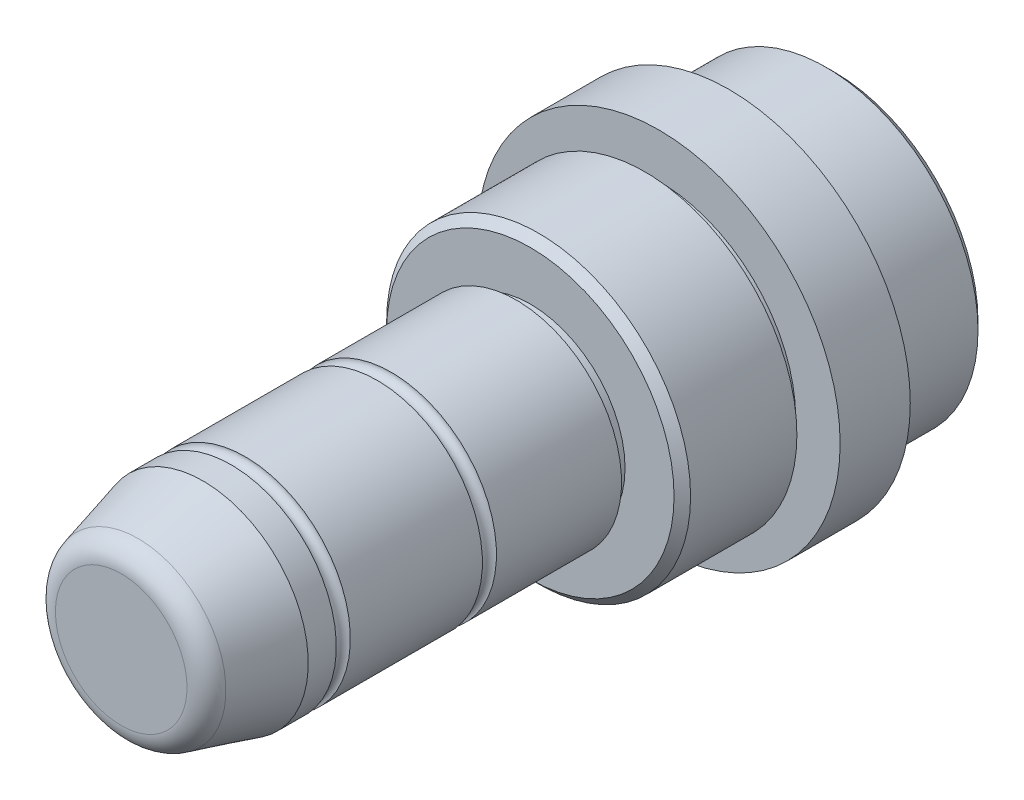
ISO-10303-21;
HEADER;
FILE_DESCRIPTION(('STEP AP214'),'2;1');
FILE_NAME('part.step','',(''),(''),'','','');
FILE_SCHEMA(('AUTOMOTIVE_DESIGN { 1 0 10303 214 1 1 1 1 }'));
ENDSEC;
DATA;
#1=APPLICATION_CONTEXT('core data for automotive mechanical design processes');
#2=APPLICATION_PROTOCOL_DEFINITION('international standard','automotive_design',2000,#1);
#3=PRODUCT_CONTEXT('',#1,'mechanical');
#4=PRODUCT('Part','Part','',(#3));
#5=PRODUCT_RELATED_PRODUCT_CATEGORY('part','',(#4));
#6=PRODUCT_DEFINITION_FORMATION('','',#4);
#7=PRODUCT_DEFINITION_CONTEXT('part definition',#1,'design');
#8=PRODUCT_DEFINITION('design','',#6,#7);
#9=PRODUCT_DEFINITION_SHAPE('','',#8);
#10=(LENGTH_UNIT() NAMED_UNIT(*) SI_UNIT(.MILLI.,.METRE.));
#11=(NAMED_UNIT(*) PLANE_ANGLE_UNIT() SI_UNIT($,.RADIAN.));
#12=(NAMED_UNIT(*) SI_UNIT($,.STERADIAN.) SOLID_ANGLE_UNIT());
#13=UNCERTAINTY_MEASURE_WITH_UNIT(LENGTH_MEASURE(1.E-05),#10,'distance_accuracy_value','');
#14=(GEOMETRIC_REPRESENTATION_CONTEXT(3) GLOBAL_UNCERTAINTY_ASSIGNED_CONTEXT((#13)) GLOBAL_UNIT_ASSIGNED_CONTEXT((#10,
#11,#12)) REPRESENTATION_CONTEXT('',''));
#15=CARTESIAN_POINT('',(0.,0.,0.));
#16=DIRECTION('',(0.,0.,1.));
#17=DIRECTION('',(1.,0.,0.));
#18=AXIS2_PLACEMENT_3D('',#15,#16,#17);
#19=CARTESIAN_POINT('',(0.,0.,59.05));
#20=DIRECTION('',(0.,0.,-1.));
#21=DIRECTION('',(-1.,0.,0.));
#22=AXIS2_PLACEMENT_3D('',#19,#20,#21);
#23=TOROIDAL_SURFACE('',#22,5.62806802642337,1.94999999999989);
#24=CARTESIAN_POINT('',(0.,0.,61.));
#25=DIRECTION('',(0.,0.,-1.));
#26=DIRECTION('',(-1.,0.,0.));
#27=AXIS2_PLACEMENT_3D('',#24,#25,#26);
#28=CIRCLE('',#27,5.6280680264232);
#29=CARTESIAN_POINT('',(-5.6280680264232,0.,61.));
#30=VERTEX_POINT('',#29);
#31=EDGE_CURVE('E10',#30,#30,#28,.T.);
#32=ORIENTED_EDGE('',*,*,#31,.T.);
#33=EDGE_LOOP('',(#32));
#34=FACE_BOUND('',#33,.T.);
#35=CARTESIAN_POINT('',(0.,0.,59.55469713795));
#36=DIRECTION('',(0.,0.,-1.));
#37=DIRECTION('',(-1.,0.,0.));
#38=AXIS2_PLACEMENT_3D('',#35,#36,#37);
#39=CIRCLE('',#38,7.5116233876868);
#40=CARTESIAN_POINT('',(-7.5116233876868,0.,59.55469713795));
#41=VERTEX_POINT('',#40);
#42=EDGE_CURVE('E105',#41,#41,#39,.T.);
#43=ORIENTED_EDGE('',*,*,#42,.F.);
#44=EDGE_LOOP('',(#43));
#45=FACE_BOUND('',#44,.T.);
#46=ADVANCED_FACE('F35',(#34,#45),#23,.T.);
#47=CARTESIAN_POINT('',(5.6280680264232,0.,61.));
#48=DIRECTION('',(0.,0.,1.));
#49=DIRECTION('',(1.,0.,0.));
#50=AXIS2_PLACEMENT_3D('',#47,#48,#49);
#51=PLANE('',#50);
#52=ORIENTED_EDGE('',*,*,#31,.F.);
#53=EDGE_LOOP('',(#52));
#54=FACE_BOUND('',#53,.T.);
#55=ADVANCED_FACE('F113',(#54),#51,.T.);
#56=CARTESIAN_POINT('',(0.,0.,0.));
#57=DIRECTION('',(0.,0.,-1.));
#58=DIRECTION('',(-1.,0.,0.));
#59=AXIS2_PLACEMENT_3D('',#56,#57,#58);
#60=PLANE('',#59);
#61=CARTESIAN_POINT('',(0.,0.,0.));
#62=DIRECTION('',(0.,0.,-1.));
#63=DIRECTION('',(-1.,0.,0.));
#64=AXIS2_PLACEMENT_3D('',#61,#62,#63);
#65=CIRCLE('',#64,12.292893218813);
#66=CARTESIAN_POINT('',(-12.292893218813,0.,0.));
#67=VERTEX_POINT('',#66);
#68=EDGE_CURVE('E41',#67,#67,#65,.T.);
#69=ORIENTED_EDGE('',*,*,#68,.T.);
#70=EDGE_LOOP('',(#69));
#71=FACE_BOUND('',#70,.T.);
#72=ADVANCED_FACE('F117',(#71),#60,.T.);
#73=CARTESIAN_POINT('',(0.,0.,0.));
#74=DIRECTION('',(0.,0.,1.));
#75=DIRECTION('',(1.,0.,0.));
#76=AXIS2_PLACEMENT_3D('',#73,#74,#75);
#77=CONICAL_SURFACE('',#76,12.292893218813,0.785398163397767);
#78=CARTESIAN_POINT('',(0.,0.,0.707106781186552));
#79=DIRECTION('',(0.,0.,-1.));
#80=DIRECTION('',(-1.,0.,0.));
#81=AXIS2_PLACEMENT_3D('',#78,#79,#80);
#82=CIRCLE('',#81,13.);
#83=CARTESIAN_POINT('',(-13.,0.,0.707106781186552));
#84=VERTEX_POINT('',#83);
#85=EDGE_CURVE('E45',#84,#84,#82,.T.);
#86=ORIENTED_EDGE('',*,*,#85,.T.);
#87=EDGE_LOOP('',(#86));
#88=FACE_BOUND('',#87,.T.);
#89=ORIENTED_EDGE('',*,*,#68,.F.);
#90=EDGE_LOOP('',(#89));
#91=FACE_BOUND('',#90,.T.);
#92=ADVANCED_FACE('F122',(#88,#91),#77,.T.);
#93=CARTESIAN_POINT('',(0.,0.,61.0050000000004));
#94=DIRECTION('',(0.,0.,-1.));
#95=DIRECTION('',(-1.,0.,0.));
#96=AXIS2_PLACEMENT_3D('',#93,#94,#95);
#97=CYLINDRICAL_SURFACE('',#96,13.);
#98=CARTESIAN_POINT('',(0.,0.,7.8));
#99=DIRECTION('',(0.,0.,-1.));
#100=DIRECTION('',(-1.,0.,0.));
#101=AXIS2_PLACEMENT_3D('',#98,#99,#100);
#102=CIRCLE('',#101,13.);
#103=CARTESIAN_POINT('',(-13.,0.,7.8));
#104=VERTEX_POINT('',#103);
#105=EDGE_CURVE('E49',#104,#104,#102,.T.);
#106=ORIENTED_EDGE('',*,*,#105,.T.);
#107=EDGE_LOOP('',(#106));
#108=FACE_BOUND('',#107,.T.);
#109=ORIENTED_EDGE('',*,*,#85,.F.);
#110=EDGE_LOOP('',(#109));
#111=FACE_BOUND('',#110,.T.);
#112=ADVANCED_FACE('F127',(#108,#111),#97,.T.);
#113=CARTESIAN_POINT('',(13.,0.,7.8));
#114=DIRECTION('',(0.,0.,1.));
#115=DIRECTION('',(1.,0.,0.));
#116=AXIS2_PLACEMENT_3D('',#113,#114,#115);
#117=PLANE('',#116);
#118=CARTESIAN_POINT('',(0.,0.,7.8));
#119=DIRECTION('',(0.,0.,-1.));
#120=DIRECTION('',(-1.,0.,0.));
#121=AXIS2_PLACEMENT_3D('',#118,#119,#120);
#122=CIRCLE('',#121,11.7);
#123=CARTESIAN_POINT('',(-11.7,0.,7.8));
#124=VERTEX_POINT('',#123);
#125=EDGE_CURVE('E54',#124,#124,#122,.T.);
#126=ORIENTED_EDGE('',*,*,#125,.T.);
#127=EDGE_LOOP('',(#126));
#128=FACE_BOUND('',#127,.T.);
#129=ORIENTED_EDGE('',*,*,#105,.F.);
#130=EDGE_LOOP('',(#129));
#131=FACE_BOUND('',#130,.T.);
#132=ADVANCED_FACE('F131',(#128,#131),#117,.T.);
#133=CARTESIAN_POINT('',(0.,0.,61.0050000000004));
#134=DIRECTION('',(0.,0.,-1.));
#135=DIRECTION('',(-1.,0.,0.));
#136=AXIS2_PLACEMENT_3D('',#133,#134,#135);
#137=CYLINDRICAL_SURFACE('',#136,11.7);
#138=CARTESIAN_POINT('',(0.,0.,9.));
#139=DIRECTION('',(0.,0.,-1.));
#140=DIRECTION('',(-1.,0.,0.));
#141=AXIS2_PLACEMENT_3D('',#138,#139,#140);
#142=CIRCLE('',#141,11.7);
#143=CARTESIAN_POINT('',(-11.7,0.,9.));
#144=VERTEX_POINT('',#143);
#145=EDGE_CURVE('E57',#144,#144,#142,.T.);
#146=ORIENTED_EDGE('',*,*,#145,.T.);
#147=EDGE_LOOP('',(#146));
#148=FACE_BOUND('',#147,.T.);
#149=ORIENTED_EDGE('',*,*,#125,.F.);
#150=EDGE_LOOP('',(#149));
#151=FACE_BOUND('',#150,.T.);
#152=ADVANCED_FACE('F135',(#148,#151),#137,.T.);
#153=CARTESIAN_POINT('',(11.7,0.,9.));
#154=DIRECTION('',(0.,0.,-1.));
#155=DIRECTION('',(-1.,0.,0.));
#156=AXIS2_PLACEMENT_3D('',#153,#154,#155);
#157=PLANE('',#156);
#158=CARTESIAN_POINT('',(0.,0.,9.));
#159=DIRECTION('',(0.,0.,-1.));
#160=DIRECTION('',(-1.,0.,0.));
#161=AXIS2_PLACEMENT_3D('',#158,#159,#160);
#162=CIRCLE('',#161,15.5);
#163=CARTESIAN_POINT('',(-15.5,0.,9.));
#164=VERTEX_POINT('',#163);
#165=EDGE_CURVE('E60',#164,#164,#162,.T.);
#166=ORIENTED_EDGE('',*,*,#165,.T.);
#167=EDGE_LOOP('',(#166));
#168=FACE_BOUND('',#167,.T.);
#169=ORIENTED_EDGE('',*,*,#145,.F.);
#170=EDGE_LOOP('',(#169));
#171=FACE_BOUND('',#170,.T.);
#172=ADVANCED_FACE('F139',(#168,#171),#157,.T.);
#173=CARTESIAN_POINT('',(0.,0.,61.0050000000004));
#174=DIRECTION('',(0.,0.,-1.));
#175=DIRECTION('',(-1.,0.,0.));
#176=AXIS2_PLACEMENT_3D('',#173,#174,#175);
#177=CYLINDRICAL_SURFACE('',#176,15.5);
#178=CARTESIAN_POINT('',(0.,0.,15.));
#179=DIRECTION('',(0.,0.,-1.));
#180=DIRECTION('',(-1.,0.,0.));
#181=AXIS2_PLACEMENT_3D('',#178,#179,#180);
#182=CIRCLE('',#181,15.5);
#183=CARTESIAN_POINT('',(-15.5,0.,15.));
#184=VERTEX_POINT('',#183);
#185=EDGE_CURVE('E63',#184,#184,#182,.T.);
#186=ORIENTED_EDGE('',*,*,#185,.T.);
#187=EDGE_LOOP('',(#186));
#188=FACE_BOUND('',#187,.T.);
#189=ORIENTED_EDGE('',*,*,#165,.F.);
#190=EDGE_LOOP('',(#189));
#191=FACE_BOUND('',#190,.T.);
#192=ADVANCED_FACE('F143',(#188,#191),#177,.T.);
#193=CARTESIAN_POINT('',(15.5,0.,15.));
#194=DIRECTION('',(0.,0.,1.));
#195=DIRECTION('',(1.,0.,0.));
#196=AXIS2_PLACEMENT_3D('',#193,#194,#195);
#197=PLANE('',#196);
#198=CARTESIAN_POINT('',(0.,0.,15.));
#199=DIRECTION('',(0.,0.,-1.));
#200=DIRECTION('',(-1.,0.,0.));
#201=AXIS2_PLACEMENT_3D('',#198,#199,#200);
#202=CIRCLE('',#201,11.7);
#203=CARTESIAN_POINT('',(-11.7,0.,15.));
#204=VERTEX_POINT('',#203);
#205=EDGE_CURVE('E66',#204,#204,#202,.T.);
#206=ORIENTED_EDGE('',*,*,#205,.T.);
#207=EDGE_LOOP('',(#206));
#208=FACE_BOUND('',#207,.T.);
#209=ORIENTED_EDGE('',*,*,#185,.F.);
#210=EDGE_LOOP('',(#209));
#211=FACE_BOUND('',#210,.T.);
#212=ADVANCED_FACE('F147',(#208,#211),#197,.T.);
#213=CARTESIAN_POINT('',(0.,0.,61.0050000000004));
#214=DIRECTION('',(0.,0.,-1.));
#215=DIRECTION('',(-1.,0.,0.));
#216=AXIS2_PLACEMENT_3D('',#213,#214,#215);
#217=CYLINDRICAL_SURFACE('',#216,11.7);
#218=CARTESIAN_POINT('',(0.,0.,16.2));
#219=DIRECTION('',(0.,0.,-1.));
#220=DIRECTION('',(-1.,0.,0.));
#221=AXIS2_PLACEMENT_3D('',#218,#219,#220);
#222=CIRCLE('',#221,11.7);
#223=CARTESIAN_POINT('',(-11.7,0.,16.2));
#224=VERTEX_POINT('',#223);
#225=EDGE_CURVE('E69',#224,#224,#222,.T.);
#226=ORIENTED_EDGE('',*,*,#225,.T.);
#227=EDGE_LOOP('',(#226));
#228=FACE_BOUND('',#227,.T.);
#229=ORIENTED_EDGE('',*,*,#205,.F.);
#230=EDGE_LOOP('',(#229));
#231=FACE_BOUND('',#230,.T.);
#232=ADVANCED_FACE('F151',(#228,#231),#217,.T.);
#233=CARTESIAN_POINT('',(11.7,0.,16.2));
#234=DIRECTION('',(0.,0.,-1.));
#235=DIRECTION('',(-1.,0.,0.));
#236=AXIS2_PLACEMENT_3D('',#233,#234,#235);
#237=PLANE('',#236);
#238=CARTESIAN_POINT('',(0.,0.,16.2));
#239=DIRECTION('',(0.,0.,-1.));
#240=DIRECTION('',(-1.,0.,0.));
#241=AXIS2_PLACEMENT_3D('',#238,#239,#240);
#242=CIRCLE('',#241,13.);
#243=CARTESIAN_POINT('',(-13.,0.,16.2));
#244=VERTEX_POINT('',#243);
#245=EDGE_CURVE('E72',#244,#244,#242,.T.);
#246=ORIENTED_EDGE('',*,*,#245,.T.);
#247=EDGE_LOOP('',(#246));
#248=FACE_BOUND('',#247,.T.);
#249=ORIENTED_EDGE('',*,*,#225,.F.);
#250=EDGE_LOOP('',(#249));
#251=FACE_BOUND('',#250,.T.);
#252=ADVANCED_FACE('F155',(#248,#251),#237,.T.);
#253=CARTESIAN_POINT('',(0.,0.,61.0050000000004));
#254=DIRECTION('',(0.,0.,-1.));
#255=DIRECTION('',(-1.,0.,0.));
#256=AXIS2_PLACEMENT_3D('',#253,#254,#255);
#257=CYLINDRICAL_SURFACE('',#256,13.);
#258=CARTESIAN_POINT('',(0.,0.,25.292893218813));
#259=DIRECTION('',(0.,0.,-1.));
#260=DIRECTION('',(-1.,0.,0.));
#261=AXIS2_PLACEMENT_3D('',#258,#259,#260);
#262=CIRCLE('',#261,13.);
#263=CARTESIAN_POINT('',(-13.,0.,25.292893218813));
#264=VERTEX_POINT('',#263);
#265=EDGE_CURVE('E75',#264,#264,#262,.T.);
#266=ORIENTED_EDGE('',*,*,#265,.T.);
#267=EDGE_LOOP('',(#266));
#268=FACE_BOUND('',#267,.T.);
#269=ORIENTED_EDGE('',*,*,#245,.F.);
#270=EDGE_LOOP('',(#269));
#271=FACE_BOUND('',#270,.T.);
#272=ADVANCED_FACE('F159',(#268,#271),#257,.T.);
#273=CARTESIAN_POINT('',(0.,0.,25.292893218813));
#274=DIRECTION('',(0.,0.,-1.));
#275=DIRECTION('',(-1.,0.,0.));
#276=AXIS2_PLACEMENT_3D('',#273,#274,#275);
#277=CONICAL_SURFACE('',#276,13.,0.785398163397447);
#278=CARTESIAN_POINT('',(0.,0.,26.));
#279=DIRECTION('',(0.,0.,-1.));
#280=DIRECTION('',(-1.,0.,0.));
#281=AXIS2_PLACEMENT_3D('',#278,#279,#280);
#282=CIRCLE('',#281,12.292893218813);
#283=CARTESIAN_POINT('',(-12.292893218813,0.,26.));
#284=VERTEX_POINT('',#283);
#285=EDGE_CURVE('E78',#284,#284,#282,.T.);
#286=ORIENTED_EDGE('',*,*,#285,.T.);
#287=EDGE_LOOP('',(#286));
#288=FACE_BOUND('',#287,.T.);
#289=ORIENTED_EDGE('',*,*,#265,.F.);
#290=EDGE_LOOP('',(#289));
#291=FACE_BOUND('',#290,.T.);
#292=ADVANCED_FACE('F163',(#288,#291),#277,.T.);
#293=CARTESIAN_POINT('',(12.292893218813,0.,26.));
#294=DIRECTION('',(0.,0.,1.));
#295=DIRECTION('',(1.,0.,0.));
#296=AXIS2_PLACEMENT_3D('',#293,#294,#295);
#297=PLANE('',#296);
#298=CARTESIAN_POINT('',(0.,0.,26.));
#299=DIRECTION('',(0.,0.,-1.));
#300=DIRECTION('',(-1.,0.,0.));
#301=AXIS2_PLACEMENT_3D('',#298,#299,#300);
#302=CIRCLE('',#301,8.1);
#303=CARTESIAN_POINT('',(-8.1,0.,26.));
#304=VERTEX_POINT('',#303);
#305=EDGE_CURVE('E81',#304,#304,#302,.T.);
#306=ORIENTED_EDGE('',*,*,#305,.T.);
#307=EDGE_LOOP('',(#306));
#308=FACE_BOUND('',#307,.T.);
#309=ORIENTED_EDGE('',*,*,#285,.F.);
#310=EDGE_LOOP('',(#309));
#311=FACE_BOUND('',#310,.T.);
#312=ADVANCED_FACE('F167',(#308,#311),#297,.T.);
#313=CARTESIAN_POINT('',(0.,0.,61.0050000000004));
#314=DIRECTION('',(0.,0.,-1.));
#315=DIRECTION('',(-1.,0.,0.));
#316=AXIS2_PLACEMENT_3D('',#313,#314,#315);
#317=CYLINDRICAL_SURFACE('',#316,8.1);
#318=CARTESIAN_POINT('',(0.,0.,27.2));
#319=DIRECTION('',(0.,0.,-1.));
#320=DIRECTION('',(-1.,0.,0.));
#321=AXIS2_PLACEMENT_3D('',#318,#319,#320);
#322=CIRCLE('',#321,8.1);
#323=CARTESIAN_POINT('',(-8.1,0.,27.2));
#324=VERTEX_POINT('',#323);
#325=EDGE_CURVE('E84',#324,#324,#322,.T.);
#326=ORIENTED_EDGE('',*,*,#325,.T.);
#327=EDGE_LOOP('',(#326));
#328=FACE_BOUND('',#327,.T.);
#329=ORIENTED_EDGE('',*,*,#305,.F.);
#330=EDGE_LOOP('',(#329));
#331=FACE_BOUND('',#330,.T.);
#332=ADVANCED_FACE('F171',(#328,#331),#317,.T.);
#333=CARTESIAN_POINT('',(8.1,0.,27.2));
#334=DIRECTION('',(0.,0.,-1.));
#335=DIRECTION('',(-1.,0.,0.));
#336=AXIS2_PLACEMENT_3D('',#333,#334,#335);
#337=PLANE('',#336);
#338=CARTESIAN_POINT('',(0.,0.,27.2));
#339=DIRECTION('',(0.,0.,-1.));
#340=DIRECTION('',(-1.,0.,0.));
#341=AXIS2_PLACEMENT_3D('',#338,#339,#340);
#342=CIRCLE('',#341,9.);
#343=CARTESIAN_POINT('',(-9.,0.,27.2));
#344=VERTEX_POINT('',#343);
#345=EDGE_CURVE('E87',#344,#344,#342,.T.);
#346=ORIENTED_EDGE('',*,*,#345,.T.);
#347=EDGE_LOOP('',(#346));
#348=FACE_BOUND('',#347,.T.);
#349=ORIENTED_EDGE('',*,*,#325,.F.);
#350=EDGE_LOOP('',(#349));
#351=FACE_BOUND('',#350,.T.);
#352=ADVANCED_FACE('F175',(#348,#351),#337,.T.);
#353=CARTESIAN_POINT('',(0.,0.,61.0050000000004));
#354=DIRECTION('',(0.,0.,-1.));
#355=DIRECTION('',(-1.,0.,0.));
#356=AXIS2_PLACEMENT_3D('',#353,#354,#355);
#357=CYLINDRICAL_SURFACE('',#356,9.);
#358=CARTESIAN_POINT('',(0.,0.,37.8999999));
#359=DIRECTION('',(0.,0.,-1.));
#360=DIRECTION('',(-1.,0.,0.));
#361=AXIS2_PLACEMENT_3D('',#358,#359,#360);
#362=CIRCLE('',#361,9.);
#363=CARTESIAN_POINT('',(-9.,0.,37.8999999));
#364=VERTEX_POINT('',#363);
#365=EDGE_CURVE('E90',#364,#364,#362,.T.);
#366=ORIENTED_EDGE('',*,*,#365,.T.);
#367=EDGE_LOOP('',(#366));
#368=FACE_BOUND('',#367,.T.);
#369=ORIENTED_EDGE('',*,*,#345,.F.);
#370=EDGE_LOOP('',(#369));
#371=FACE_BOUND('',#370,.T.);
#372=ADVANCED_FACE('F179',(#368,#371),#357,.T.);
#373=CARTESIAN_POINT('',(0.,0.,38.4999999));
#374=DIRECTION('',(0.,0.,-1.));
#375=DIRECTION('',(-1.,0.,0.));
#376=AXIS2_PLACEMENT_3D('',#373,#374,#375);
#377=TOROIDAL_SURFACE('',#376,9.,0.599999999999996);
#378=CARTESIAN_POINT('',(0.,0.,39.0999999));
#379=DIRECTION('',(0.,0.,-1.));
#380=DIRECTION('',(-1.,0.,0.));
#381=AXIS2_PLACEMENT_3D('',#378,#379,#380);
#382=CIRCLE('',#381,9.);
#383=CARTESIAN_POINT('',(-9.,0.,39.0999999));
#384=VERTEX_POINT('',#383);
#385=EDGE_CURVE('E93',#384,#384,#382,.T.);
#386=ORIENTED_EDGE('',*,*,#385,.T.);
#387=EDGE_LOOP('',(#386));
#388=FACE_BOUND('',#387,.T.);
#389=ORIENTED_EDGE('',*,*,#365,.F.);
#390=EDGE_LOOP('',(#389));
#391=FACE_BOUND('',#390,.T.);
#392=ADVANCED_FACE('F183',(#388,#391),#377,.F.);
#393=CARTESIAN_POINT('',(0.,0.,61.0050000000004));
#394=DIRECTION('',(0.,0.,-1.));
#395=DIRECTION('',(-1.,0.,0.));
#396=AXIS2_PLACEMENT_3D('',#393,#394,#395);
#397=CYLINDRICAL_SURFACE('',#396,9.);
#398=CARTESIAN_POINT('',(0.,0.,50.4));
#399=DIRECTION('',(0.,0.,-1.));
#400=DIRECTION('',(-1.,0.,0.));
#401=AXIS2_PLACEMENT_3D('',#398,#399,#400);
#402=CIRCLE('',#401,9.);
#403=CARTESIAN_POINT('',(-9.,0.,50.4));
#404=VERTEX_POINT('',#403);
#405=EDGE_CURVE('E96',#404,#404,#402,.T.);
#406=ORIENTED_EDGE('',*,*,#405,.T.);
#407=EDGE_LOOP('',(#406));
#408=FACE_BOUND('',#407,.T.);
#409=ORIENTED_EDGE('',*,*,#385,.F.);
#410=EDGE_LOOP('',(#409));
#411=FACE_BOUND('',#410,.T.);
#412=ADVANCED_FACE('F187',(#408,#411),#397,.T.);
#413=CARTESIAN_POINT('',(0.,0.,51.));
#414=DIRECTION('',(0.,0.,-1.));
#415=DIRECTION('',(-1.,0.,0.));
#416=AXIS2_PLACEMENT_3D('',#413,#414,#415);
#417=TOROIDAL_SURFACE('',#416,9.,0.600000000000003);
#418=CARTESIAN_POINT('',(0.,0.,51.6));
#419=DIRECTION('',(0.,0.,-1.));
#420=DIRECTION('',(-1.,0.,0.));
#421=AXIS2_PLACEMENT_3D('',#418,#419,#420);
#422=CIRCLE('',#421,9.);
#423=CARTESIAN_POINT('',(-9.,0.,51.6));
#424=VERTEX_POINT('',#423);
#425=EDGE_CURVE('E99',#424,#424,#422,.T.);
#426=ORIENTED_EDGE('',*,*,#425,.T.);
#427=EDGE_LOOP('',(#426));
#428=FACE_BOUND('',#427,.T.);
#429=ORIENTED_EDGE('',*,*,#405,.F.);
#430=EDGE_LOOP('',(#429));
#431=FACE_BOUND('',#430,.T.);
#432=ADVANCED_FACE('F191',(#428,#431),#417,.F.);
#433=CARTESIAN_POINT('',(0.,0.,61.0050000000004));
#434=DIRECTION('',(0.,0.,-1.));
#435=DIRECTION('',(-1.,0.,0.));
#436=AXIS2_PLACEMENT_3D('',#433,#434,#435);
#437=CYLINDRICAL_SURFACE('',#436,9.);
#438=CARTESIAN_POINT('',(0.,0.,54.));
#439=DIRECTION('',(0.,0.,-1.));
#440=DIRECTION('',(-1.,0.,0.));
#441=AXIS2_PLACEMENT_3D('',#438,#439,#440);
#442=CIRCLE('',#441,9.);
#443=CARTESIAN_POINT('',(-9.,0.,54.));
#444=VERTEX_POINT('',#443);
#445=EDGE_CURVE('E102',#444,#444,#442,.T.);
#446=ORIENTED_EDGE('',*,*,#445,.T.);
#447=EDGE_LOOP('',(#446));
#448=FACE_BOUND('',#447,.T.);
#449=ORIENTED_EDGE('',*,*,#425,.F.);
#450=EDGE_LOOP('',(#449));
#451=FACE_BOUND('',#450,.T.);
#452=ADVANCED_FACE('F195',(#448,#451),#437,.T.);
#453=CARTESIAN_POINT('',(0.,0.,54.));
#454=DIRECTION('',(0.,0.,-1.));
#455=DIRECTION('',(-1.,0.,0.));
#456=AXIS2_PLACEMENT_3D('',#453,#454,#455);
#457=CONICAL_SURFACE('',#456,9.,0.261799387799156);
#458=ORIENTED_EDGE('',*,*,#42,.T.);
#459=EDGE_LOOP('',(#458));
#460=FACE_BOUND('',#459,.T.);
#461=ORIENTED_EDGE('',*,*,#445,.F.);
#462=EDGE_LOOP('',(#461));
#463=FACE_BOUND('',#462,.T.);
#464=ADVANCED_FACE('F109',(#460,#463),#457,.T.);
#465=CLOSED_SHELL('',(#46,#55,#72,#92,#112,#132,#152,#172,#192,#212,#232,#252,#272,#292,#312,
#332,#352,#372,#392,#412,#432,#452,#464));
#466=MANIFOLD_SOLID_BREP('B2',#465);
#467=ADVANCED_BREP_SHAPE_REPRESENTATION('',(#18,#466),#14);
#468=SHAPE_DEFINITION_REPRESENTATION(#9,#467);
ENDSEC;
END-ISO-10303-21;
